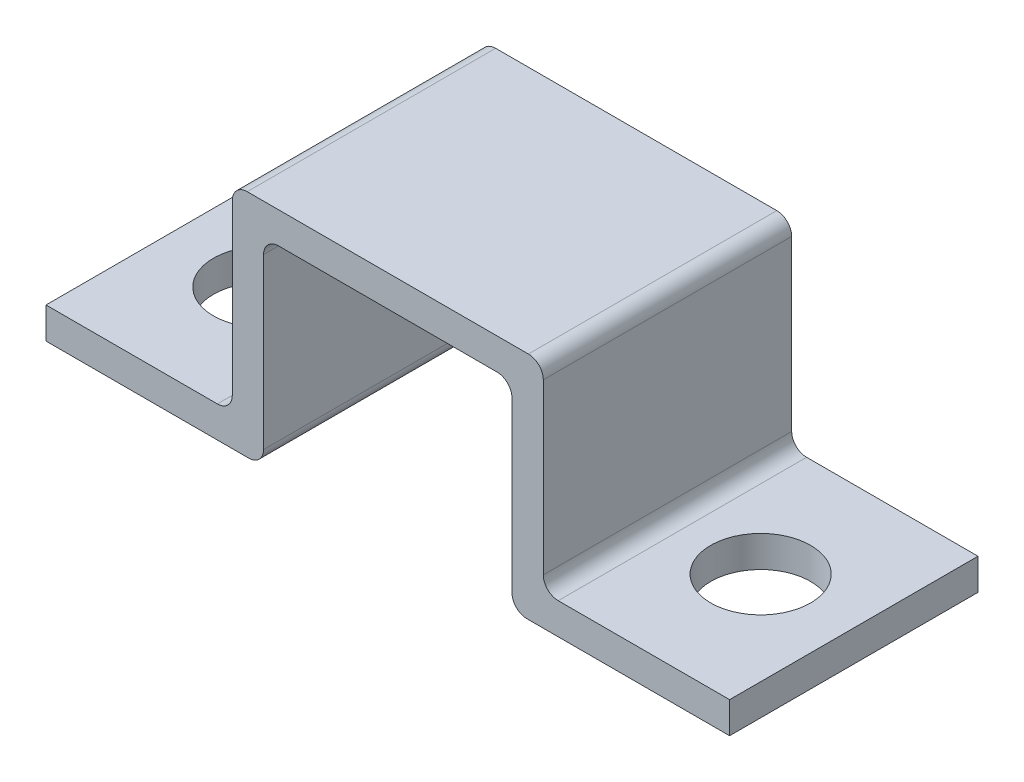
ISO-10303-21;
HEADER;
FILE_DESCRIPTION(('STEP AP214'),'2;1');
FILE_NAME('part.step','',(''),(''),'','','');
FILE_SCHEMA(('AUTOMOTIVE_DESIGN { 1 0 10303 214 1 1 1 1 }'));
ENDSEC;
DATA;
#1=APPLICATION_CONTEXT('core data for automotive mechanical design processes');
#2=APPLICATION_PROTOCOL_DEFINITION('international standard','automotive_design',2000,#1);
#3=PRODUCT_CONTEXT('',#1,'mechanical');
#4=PRODUCT('Part','Part','',(#3));
#5=PRODUCT_RELATED_PRODUCT_CATEGORY('part','',(#4));
#6=PRODUCT_DEFINITION_FORMATION('','',#4);
#7=PRODUCT_DEFINITION_CONTEXT('part definition',#1,'design');
#8=PRODUCT_DEFINITION('design','',#6,#7);
#9=PRODUCT_DEFINITION_SHAPE('','',#8);
#10=(LENGTH_UNIT() NAMED_UNIT(*) SI_UNIT(.MILLI.,.METRE.));
#11=(NAMED_UNIT(*) PLANE_ANGLE_UNIT() SI_UNIT($,.RADIAN.));
#12=(NAMED_UNIT(*) SI_UNIT($,.STERADIAN.) SOLID_ANGLE_UNIT());
#13=UNCERTAINTY_MEASURE_WITH_UNIT(LENGTH_MEASURE(1.E-05),#10,'distance_accuracy_value','');
#14=(GEOMETRIC_REPRESENTATION_CONTEXT(3) GLOBAL_UNCERTAINTY_ASSIGNED_CONTEXT((#13)) GLOBAL_UNIT_ASSIGNED_CONTEXT((#10,
#11,#12)) REPRESENTATION_CONTEXT('',''));
#15=CARTESIAN_POINT('',(0.,0.,0.));
#16=DIRECTION('',(0.,0.,1.));
#17=DIRECTION('',(1.,0.,0.));
#18=AXIS2_PLACEMENT_3D('',#15,#16,#17);
#19=CARTESIAN_POINT('',(-7.95019999999999,-10.16,6.35000000000001));
#20=DIRECTION('',(0.,-1.,0.));
#21=DIRECTION('',(0.,0.,-1.));
#22=AXIS2_PLACEMENT_3D('',#19,#20,#21);
#23=PLANE('',#22);
#24=DIRECTION('',(1.,0.,0.));
#25=VECTOR('',#24,1.);
#26=CARTESIAN_POINT('',(-7.95019999999999,-10.16,-6.35));
#27=LINE('',#26,#25);
#28=CARTESIAN_POINT('',(-17.4752,-10.16,-6.35));
#29=VERTEX_POINT('',#28);
#30=CARTESIAN_POINT('',(-7.11199999999999,-10.16,-6.35));
#31=VERTEX_POINT('',#30);
#32=EDGE_CURVE('E660',#29,#31,#27,.T.);
#33=ORIENTED_EDGE('',*,*,#32,.T.);
#34=DIRECTION('',(0.,0.,-1.));
#35=VECTOR('',#34,1.);
#36=CARTESIAN_POINT('',(-7.11199999999999,-10.16,6.35000000000001));
#37=LINE('',#36,#35);
#38=CARTESIAN_POINT('',(-7.11199999999999,-10.16,6.35000000000001));
#39=VERTEX_POINT('',#38);
#40=EDGE_CURVE('E390',#31,#39,#37,.F.);
#41=ORIENTED_EDGE('',*,*,#40,.T.);
#42=DIRECTION('',(1.,0.,0.));
#43=VECTOR('',#42,1.);
#44=CARTESIAN_POINT('',(-7.95019999999999,-10.16,6.35000000000001));
#45=LINE('',#44,#43);
#46=CARTESIAN_POINT('',(-17.4752,-10.16,6.35000000000001));
#47=VERTEX_POINT('',#46);
#48=EDGE_CURVE('E224',#47,#39,#45,.T.);
#49=ORIENTED_EDGE('',*,*,#48,.F.);
#50=DIRECTION('',(0.,0.,-1.));
#51=VECTOR('',#50,1.);
#52=CARTESIAN_POINT('',(-17.4752,-10.16,6.35000000000001));
#53=LINE('',#52,#51);
#54=EDGE_CURVE('E192',#47,#29,#53,.T.);
#55=ORIENTED_EDGE('',*,*,#54,.T.);
#56=EDGE_LOOP('',(#33,#41,#49,#55));
#57=FACE_BOUND('',#56,.T.);
#58=CARTESIAN_POINT('',(-12.7127,-10.16,0.));
#59=DIRECTION('',(0.,-1.,0.));
#60=DIRECTION('',(0.,0.,-1.));
#61=AXIS2_PLACEMENT_3D('',#58,#59,#60);
#62=CIRCLE('',#61,2.5527);
#63=CARTESIAN_POINT('',(-12.7127,-10.16,-2.5527));
#64=VERTEX_POINT('',#63);
#65=EDGE_CURVE('E193',#64,#64,#62,.F.);
#66=ORIENTED_EDGE('',*,*,#65,.T.);
#67=EDGE_LOOP('',(#66));
#68=FACE_BOUND('',#67,.T.);
#69=ADVANCED_FACE('F33',(#57,#68),#23,.T.);
#70=CARTESIAN_POINT('',(-17.4752,-8.5598,6.35000000000001));
#71=DIRECTION('',(0.,1.,0.));
#72=DIRECTION('',(0.,0.,1.));
#73=AXIS2_PLACEMENT_3D('',#70,#71,#72);
#74=PLANE('',#73);
#75=DIRECTION('',(1.,0.,0.));
#76=VECTOR('',#75,1.);
#77=CARTESIAN_POINT('',(-17.4752,-8.5598,6.35000000000001));
#78=LINE('',#77,#76);
#79=CARTESIAN_POINT('',(-17.4752,-8.5598,6.35000000000001));
#80=VERTEX_POINT('',#79);
#81=CARTESIAN_POINT('',(-8.7122,-8.5598,6.35000000000001));
#82=VERTEX_POINT('',#81);
#83=EDGE_CURVE('E171',#80,#82,#78,.T.);
#84=ORIENTED_EDGE('',*,*,#83,.T.);
#85=DIRECTION('',(0.,0.,1.));
#86=VECTOR('',#85,1.);
#87=CARTESIAN_POINT('',(-8.71219999999999,-8.5598,-6.35));
#88=LINE('',#87,#86);
#89=CARTESIAN_POINT('',(-8.7122,-8.5598,-6.35));
#90=VERTEX_POINT('',#89);
#91=EDGE_CURVE('E354',#82,#90,#88,.F.);
#92=ORIENTED_EDGE('',*,*,#91,.T.);
#93=DIRECTION('',(1.,0.,0.));
#94=VECTOR('',#93,1.);
#95=CARTESIAN_POINT('',(-17.4752,-8.5598,-6.35));
#96=LINE('',#95,#94);
#97=CARTESIAN_POINT('',(-17.4752,-8.5598,-6.35));
#98=VERTEX_POINT('',#97);
#99=EDGE_CURVE('E183',#98,#90,#96,.T.);
#100=ORIENTED_EDGE('',*,*,#99,.F.);
#101=DIRECTION('',(0.,0.,1.));
#102=VECTOR('',#101,1.);
#103=CARTESIAN_POINT('',(-17.4752,-8.5598,6.35000000000001));
#104=LINE('',#103,#102);
#105=EDGE_CURVE('E189',#98,#80,#104,.T.);
#106=ORIENTED_EDGE('',*,*,#105,.T.);
#107=EDGE_LOOP('',(#84,#92,#100,#106));
#108=FACE_BOUND('',#107,.T.);
#109=CARTESIAN_POINT('',(-12.7127,-8.5598,0.));
#110=DIRECTION('',(0.,-1.,0.));
#111=DIRECTION('',(0.,0.,1.));
#112=AXIS2_PLACEMENT_3D('',#109,#110,#111);
#113=CIRCLE('',#112,2.5527);
#114=CARTESIAN_POINT('',(-12.7127,-8.5598,2.5527));
#115=VERTEX_POINT('',#114);
#116=EDGE_CURVE('E656',#115,#115,#113,.T.);
#117=ORIENTED_EDGE('',*,*,#116,.T.);
#118=EDGE_LOOP('',(#117));
#119=FACE_BOUND('',#118,.T.);
#120=ADVANCED_FACE('F195',(#108,#119),#74,.T.);
#121=CARTESIAN_POINT('',(-7.95019999999999,0.,0.));
#122=DIRECTION('',(-1.,0.,0.));
#123=DIRECTION('',(0.,0.,-1.));
#124=AXIS2_PLACEMENT_3D('',#121,#122,#123);
#125=PLANE('',#124);
#126=DIRECTION('',(0.,1.,0.));
#127=VECTOR('',#126,1.);
#128=CARTESIAN_POINT('',(-7.95019999999999,1.6002,-6.34999999999999));
#129=LINE('',#128,#127);
#130=CARTESIAN_POINT('',(-7.95019999999999,-7.7978,-6.35));
#131=VERTEX_POINT('',#130);
#132=CARTESIAN_POINT('',(-7.95019999999999,0.8382,-6.34999999999999));
#133=VERTEX_POINT('',#132);
#134=EDGE_CURVE('E212',#131,#133,#129,.T.);
#135=ORIENTED_EDGE('',*,*,#134,.F.);
#136=DIRECTION('',(0.,0.,1.));
#137=VECTOR('',#136,1.);
#138=CARTESIAN_POINT('',(-7.95019999999999,-7.7978,6.35000000000001));
#139=LINE('',#138,#137);
#140=CARTESIAN_POINT('',(-7.95019999999999,-7.7978,6.35000000000001));
#141=VERTEX_POINT('',#140);
#142=EDGE_CURVE('E398',#131,#141,#139,.T.);
#143=ORIENTED_EDGE('',*,*,#142,.T.);
#144=DIRECTION('',(0.,-1.,0.));
#145=VECTOR('',#144,1.);
#146=CARTESIAN_POINT('',(-7.95019999999999,1.6002,6.35000000000001));
#147=LINE('',#146,#145);
#148=CARTESIAN_POINT('',(-7.95019999999999,0.8382,6.35000000000001));
#149=VERTEX_POINT('',#148);
#150=EDGE_CURVE('E209',#149,#141,#147,.T.);
#151=ORIENTED_EDGE('',*,*,#150,.F.);
#152=DIRECTION('',(0.,0.,1.));
#153=VECTOR('',#152,1.);
#154=CARTESIAN_POINT('',(-7.95019999999999,0.8382,-6.34999999999999));
#155=LINE('',#154,#153);
#156=EDGE_CURVE('E396',#149,#133,#155,.F.);
#157=ORIENTED_EDGE('',*,*,#156,.T.);
#158=EDGE_LOOP('',(#135,#143,#151,#157));
#159=FACE_BOUND('',#158,.T.);
#160=ADVANCED_FACE('F405',(#159),#125,.T.);
#161=CARTESIAN_POINT('',(-6.35000000000001,1.6002,-6.34999999999999));
#162=DIRECTION('',(0.,0.,1.));
#163=DIRECTION('',(1.,0.,0.));
#164=AXIS2_PLACEMENT_3D('',#161,#162,#163);
#165=PLANE('',#164);
#166=DIRECTION('',(-1.,0.,0.));
#167=VECTOR('',#166,1.);
#168=CARTESIAN_POINT('',(7.95019999999999,-10.16,-6.35));
#169=LINE('',#168,#167);
#170=CARTESIAN_POINT('',(17.4752,-10.16,-6.35));
#171=VERTEX_POINT('',#170);
#172=CARTESIAN_POINT('',(7.11199999999999,-10.16,-6.35));
#173=VERTEX_POINT('',#172);
#174=EDGE_CURVE('E239',#171,#173,#169,.T.);
#175=ORIENTED_EDGE('',*,*,#174,.T.);
#176=CARTESIAN_POINT('',(7.11199999999999,-9.398,-6.34999999999999));
#177=DIRECTION('',(0.,0.,1.));
#178=DIRECTION('',(1.,0.,0.));
#179=AXIS2_PLACEMENT_3D('',#176,#177,#178);
#180=CIRCLE('',#179,0.762);
#181=CARTESIAN_POINT('',(6.34999999999999,-9.398,-6.35));
#182=VERTEX_POINT('',#181);
#183=EDGE_CURVE('E255',#173,#182,#180,.F.);
#184=ORIENTED_EDGE('',*,*,#183,.T.);
#185=DIRECTION('',(0.,1.,0.));
#186=VECTOR('',#185,1.);
#187=CARTESIAN_POINT('',(6.34999999999999,1.6002,-6.34999999999999));
#188=LINE('',#187,#186);
#189=CARTESIAN_POINT('',(6.34999999999999,-0.761999999999999,-6.34999999999999));
#190=VERTEX_POINT('',#189);
#191=EDGE_CURVE('E240',#182,#190,#188,.T.);
#192=ORIENTED_EDGE('',*,*,#191,.T.);
#193=CARTESIAN_POINT('',(5.58799999999999,-0.762,-6.34999999999999));
#194=DIRECTION('',(0.,0.,1.));
#195=DIRECTION('',(1.,0.,0.));
#196=AXIS2_PLACEMENT_3D('',#193,#194,#195);
#197=CIRCLE('',#196,0.762);
#198=CARTESIAN_POINT('',(5.58799999999999,0.,-6.34999999999999));
#199=VERTEX_POINT('',#198);
#200=EDGE_CURVE('E361',#190,#199,#197,.T.);
#201=ORIENTED_EDGE('',*,*,#200,.T.);
#202=DIRECTION('',(-1.,0.,0.));
#203=VECTOR('',#202,1.);
#204=CARTESIAN_POINT('',(-6.35000000000001,0.,-6.34999999999999));
#205=LINE('',#204,#203);
#206=CARTESIAN_POINT('',(-5.58799999999999,0.,-6.34999999999999));
#207=VERTEX_POINT('',#206);
#208=EDGE_CURVE('E230',#199,#207,#205,.T.);
#209=ORIENTED_EDGE('',*,*,#208,.T.);
#210=CARTESIAN_POINT('',(-5.58799999999999,-0.762,-6.34999999999999));
#211=DIRECTION('',(0.,0.,1.));
#212=DIRECTION('',(1.,0.,0.));
#213=AXIS2_PLACEMENT_3D('',#210,#211,#212);
#214=CIRCLE('',#213,0.762);
#215=CARTESIAN_POINT('',(-6.34999999999999,-0.761999999999999,-6.34999999999999));
#216=VERTEX_POINT('',#215);
#217=EDGE_CURVE('E366',#207,#216,#214,.T.);
#218=ORIENTED_EDGE('',*,*,#217,.T.);
#219=DIRECTION('',(0.,1.,0.));
#220=VECTOR('',#219,1.);
#221=CARTESIAN_POINT('',(-6.34999999999999,1.6002,-6.34999999999999));
#222=LINE('',#221,#220);
#223=CARTESIAN_POINT('',(-6.34999999999999,-9.398,-6.35));
#224=VERTEX_POINT('',#223);
#225=EDGE_CURVE('E213',#224,#216,#222,.T.);
#226=ORIENTED_EDGE('',*,*,#225,.F.);
#227=CARTESIAN_POINT('',(-7.11199999999999,-9.398,-6.34999999999999));
#228=DIRECTION('',(0.,0.,1.));
#229=DIRECTION('',(1.,0.,0.));
#230=AXIS2_PLACEMENT_3D('',#227,#228,#229);
#231=CIRCLE('',#230,0.762);
#232=EDGE_CURVE('E334',#224,#31,#231,.F.);
#233=ORIENTED_EDGE('',*,*,#232,.T.);
#234=ORIENTED_EDGE('',*,*,#32,.F.);
#235=DIRECTION('',(0.,1.,0.));
#236=VECTOR('',#235,1.);
#237=CARTESIAN_POINT('',(-17.4752,-10.16,-6.35));
#238=LINE('',#237,#236);
#239=EDGE_CURVE('E198',#29,#98,#238,.T.);
#240=ORIENTED_EDGE('',*,*,#239,.T.);
#241=ORIENTED_EDGE('',*,*,#99,.T.);
#242=CARTESIAN_POINT('',(-8.71219999999999,-7.7978,-6.34999999999999));
#243=DIRECTION('',(0.,0.,1.));
#244=DIRECTION('',(1.,0.,0.));
#245=AXIS2_PLACEMENT_3D('',#242,#243,#244);
#246=CIRCLE('',#245,0.762);
#247=EDGE_CURVE('E369',#90,#131,#246,.T.);
#248=ORIENTED_EDGE('',*,*,#247,.T.);
#249=ORIENTED_EDGE('',*,*,#134,.T.);
#250=CARTESIAN_POINT('',(-7.18819999999999,0.8382,-6.34999999999999));
#251=DIRECTION('',(0.,0.,1.));
#252=DIRECTION('',(1.,0.,0.));
#253=AXIS2_PLACEMENT_3D('',#250,#251,#252);
#254=CIRCLE('',#253,0.762);
#255=CARTESIAN_POINT('',(-7.18819999999999,1.6002,-6.34999999999999));
#256=VERTEX_POINT('',#255);
#257=EDGE_CURVE('E291',#133,#256,#254,.F.);
#258=ORIENTED_EDGE('',*,*,#257,.T.);
#259=DIRECTION('',(-1.,0.,0.));
#260=VECTOR('',#259,1.);
#261=CARTESIAN_POINT('',(-6.35000000000001,1.6002,-6.34999999999999));
#262=LINE('',#261,#260);
#263=CARTESIAN_POINT('',(7.18819999999999,1.6002,-6.34999999999999));
#264=VERTEX_POINT('',#263);
#265=EDGE_CURVE('E264',#264,#256,#262,.T.);
#266=ORIENTED_EDGE('',*,*,#265,.F.);
#267=CARTESIAN_POINT('',(7.18819999999999,0.8382,-6.34999999999999));
#268=DIRECTION('',(0.,0.,1.));
#269=DIRECTION('',(1.,0.,0.));
#270=AXIS2_PLACEMENT_3D('',#267,#268,#269);
#271=CIRCLE('',#270,0.762);
#272=CARTESIAN_POINT('',(7.95019999999999,0.8382,-6.34999999999999));
#273=VERTEX_POINT('',#272);
#274=EDGE_CURVE('E285',#264,#273,#271,.F.);
#275=ORIENTED_EDGE('',*,*,#274,.T.);
#276=DIRECTION('',(0.,1.,0.));
#277=VECTOR('',#276,1.);
#278=CARTESIAN_POINT('',(7.95019999999999,1.6002,-6.34999999999999));
#279=LINE('',#278,#277);
#280=CARTESIAN_POINT('',(7.95019999999999,-7.7978,-6.35));
#281=VERTEX_POINT('',#280);
#282=EDGE_CURVE('E235',#281,#273,#279,.T.);
#283=ORIENTED_EDGE('',*,*,#282,.F.);
#284=CARTESIAN_POINT('',(8.71219999999999,-7.7978,-6.34999999999999));
#285=DIRECTION('',(0.,0.,1.));
#286=DIRECTION('',(1.,0.,0.));
#287=AXIS2_PLACEMENT_3D('',#284,#285,#286);
#288=CIRCLE('',#287,0.762);
#289=CARTESIAN_POINT('',(8.7122,-8.5598,-6.35));
#290=VERTEX_POINT('',#289);
#291=EDGE_CURVE('E11',#281,#290,#288,.T.);
#292=ORIENTED_EDGE('',*,*,#291,.T.);
#293=DIRECTION('',(-1.,0.,0.));
#294=VECTOR('',#293,1.);
#295=CARTESIAN_POINT('',(17.4752,-8.5598,-6.35));
#296=LINE('',#295,#294);
#297=CARTESIAN_POINT('',(17.4752,-8.5598,-6.35));
#298=VERTEX_POINT('',#297);
#299=EDGE_CURVE('E254',#298,#290,#296,.T.);
#300=ORIENTED_EDGE('',*,*,#299,.F.);
#301=DIRECTION('',(0.,1.,0.));
#302=VECTOR('',#301,1.);
#303=CARTESIAN_POINT('',(17.4752,-10.16,-6.35));
#304=LINE('',#303,#302);
#305=EDGE_CURVE('E307',#171,#298,#304,.T.);
#306=ORIENTED_EDGE('',*,*,#305,.F.);
#307=EDGE_LOOP('',(#175,#184,#192,#201,#209,#218,#226,#233,#234,#240,#241,#248,#249,#258,#266,
#275,#283,#292,#300,#306));
#308=FACE_BOUND('',#307,.T.);
#309=ADVANCED_FACE('F303',(#308),#165,.F.);
#310=CARTESIAN_POINT('',(-6.35000000000001,1.6002,6.35000000000001));
#311=DIRECTION('',(0.,0.,-1.));
#312=DIRECTION('',(-1.,0.,0.));
#313=AXIS2_PLACEMENT_3D('',#310,#311,#312);
#314=PLANE('',#313);
#315=DIRECTION('',(0.,-1.,0.));
#316=VECTOR('',#315,1.);
#317=CARTESIAN_POINT('',(6.34999999999999,1.6002,6.35000000000001));
#318=LINE('',#317,#316);
#319=CARTESIAN_POINT('',(6.34999999999999,-0.761999999999999,6.35000000000001));
#320=VERTEX_POINT('',#319);
#321=CARTESIAN_POINT('',(6.34999999999999,-9.398,6.35000000000001));
#322=VERTEX_POINT('',#321);
#323=EDGE_CURVE('E251',#320,#322,#318,.T.);
#324=ORIENTED_EDGE('',*,*,#323,.T.);
#325=CARTESIAN_POINT('',(7.11199999999999,-9.398,6.35000000000001));
#326=DIRECTION('',(0.,0.,-1.));
#327=DIRECTION('',(-1.,0.,0.));
#328=AXIS2_PLACEMENT_3D('',#325,#326,#327);
#329=CIRCLE('',#328,0.762);
#330=CARTESIAN_POINT('',(7.11199999999999,-10.16,6.35000000000001));
#331=VERTEX_POINT('',#330);
#332=EDGE_CURVE('E330',#322,#331,#329,.F.);
#333=ORIENTED_EDGE('',*,*,#332,.T.);
#334=DIRECTION('',(-1.,0.,0.));
#335=VECTOR('',#334,1.);
#336=CARTESIAN_POINT('',(7.95019999999999,-10.16,6.35000000000001));
#337=LINE('',#336,#335);
#338=CARTESIAN_POINT('',(17.4752,-10.16,6.35000000000001));
#339=VERTEX_POINT('',#338);
#340=EDGE_CURVE('E300',#339,#331,#337,.T.);
#341=ORIENTED_EDGE('',*,*,#340,.F.);
#342=DIRECTION('',(0.,-1.,0.));
#343=VECTOR('',#342,1.);
#344=CARTESIAN_POINT('',(17.4752,-10.16,6.35000000000001));
#345=LINE('',#344,#343);
#346=CARTESIAN_POINT('',(17.4752,-8.5598,6.35000000000001));
#347=VERTEX_POINT('',#346);
#348=EDGE_CURVE('E316',#347,#339,#345,.T.);
#349=ORIENTED_EDGE('',*,*,#348,.F.);
#350=DIRECTION('',(-1.,0.,0.));
#351=VECTOR('',#350,1.);
#352=CARTESIAN_POINT('',(17.4752,-8.5598,6.35000000000001));
#353=LINE('',#352,#351);
#354=CARTESIAN_POINT('',(8.7122,-8.5598,6.35000000000001));
#355=VERTEX_POINT('',#354);
#356=EDGE_CURVE('E269',#347,#355,#353,.T.);
#357=ORIENTED_EDGE('',*,*,#356,.T.);
#358=CARTESIAN_POINT('',(8.71219999999999,-7.7978,6.35000000000001));
#359=DIRECTION('',(0.,0.,-1.));
#360=DIRECTION('',(-1.,0.,0.));
#361=AXIS2_PLACEMENT_3D('',#358,#359,#360);
#362=CIRCLE('',#361,0.762);
#363=CARTESIAN_POINT('',(7.95019999999999,-7.7978,6.35000000000001));
#364=VERTEX_POINT('',#363);
#365=EDGE_CURVE('E41',#355,#364,#362,.T.);
#366=ORIENTED_EDGE('',*,*,#365,.T.);
#367=DIRECTION('',(0.,-1.,0.));
#368=VECTOR('',#367,1.);
#369=CARTESIAN_POINT('',(7.95019999999999,1.6002,6.35000000000001));
#370=LINE('',#369,#368);
#371=CARTESIAN_POINT('',(7.95019999999999,0.8382,6.35000000000001));
#372=VERTEX_POINT('',#371);
#373=EDGE_CURVE('E214',#372,#364,#370,.T.);
#374=ORIENTED_EDGE('',*,*,#373,.F.);
#375=CARTESIAN_POINT('',(7.18819999999999,0.8382,6.35000000000001));
#376=DIRECTION('',(0.,0.,-1.));
#377=DIRECTION('',(-1.,0.,0.));
#378=AXIS2_PLACEMENT_3D('',#375,#376,#377);
#379=CIRCLE('',#378,0.762);
#380=CARTESIAN_POINT('',(7.18819999999999,1.6002,6.35000000000001));
#381=VERTEX_POINT('',#380);
#382=EDGE_CURVE('E218',#372,#381,#379,.F.);
#383=ORIENTED_EDGE('',*,*,#382,.T.);
#384=DIRECTION('',(1.,0.,0.));
#385=VECTOR('',#384,1.);
#386=CARTESIAN_POINT('',(-6.35000000000001,1.6002,6.35000000000001));
#387=LINE('',#386,#385);
#388=CARTESIAN_POINT('',(-7.18819999999999,1.6002,6.35000000000001));
#389=VERTEX_POINT('',#388);
#390=EDGE_CURVE('E286',#389,#381,#387,.T.);
#391=ORIENTED_EDGE('',*,*,#390,.F.);
#392=CARTESIAN_POINT('',(-7.18819999999999,0.8382,6.35000000000001));
#393=DIRECTION('',(0.,0.,-1.));
#394=DIRECTION('',(-1.,0.,0.));
#395=AXIS2_PLACEMENT_3D('',#392,#393,#394);
#396=CIRCLE('',#395,0.762);
#397=EDGE_CURVE('E349',#389,#149,#396,.F.);
#398=ORIENTED_EDGE('',*,*,#397,.T.);
#399=ORIENTED_EDGE('',*,*,#150,.T.);
#400=CARTESIAN_POINT('',(-8.71219999999999,-7.7978,6.35000000000001));
#401=DIRECTION('',(0.,0.,-1.));
#402=DIRECTION('',(-1.,0.,0.));
#403=AXIS2_PLACEMENT_3D('',#400,#401,#402);
#404=CIRCLE('',#403,0.762);
#405=EDGE_CURVE('E178',#141,#82,#404,.T.);
#406=ORIENTED_EDGE('',*,*,#405,.T.);
#407=ORIENTED_EDGE('',*,*,#83,.F.);
#408=DIRECTION('',(0.,-1.,0.));
#409=VECTOR('',#408,1.);
#410=CARTESIAN_POINT('',(-17.4752,-10.16,6.35000000000001));
#411=LINE('',#410,#409);
#412=EDGE_CURVE('E175',#80,#47,#411,.T.);
#413=ORIENTED_EDGE('',*,*,#412,.T.);
#414=ORIENTED_EDGE('',*,*,#48,.T.);
#415=CARTESIAN_POINT('',(-7.11199999999999,-9.398,6.35000000000001));
#416=DIRECTION('',(0.,0.,-1.));
#417=DIRECTION('',(-1.,0.,0.));
#418=AXIS2_PLACEMENT_3D('',#415,#416,#417);
#419=CIRCLE('',#418,0.762);
#420=CARTESIAN_POINT('',(-6.34999999999999,-9.398,6.35000000000001));
#421=VERTEX_POINT('',#420);
#422=EDGE_CURVE('E48',#39,#421,#419,.F.);
#423=ORIENTED_EDGE('',*,*,#422,.T.);
#424=DIRECTION('',(0.,-1.,0.));
#425=VECTOR('',#424,1.);
#426=CARTESIAN_POINT('',(-6.34999999999999,1.6002,6.35000000000001));
#427=LINE('',#426,#425);
#428=CARTESIAN_POINT('',(-6.34999999999999,-0.761999999999999,6.35000000000001));
#429=VERTEX_POINT('',#428);
#430=EDGE_CURVE('E182',#429,#421,#427,.T.);
#431=ORIENTED_EDGE('',*,*,#430,.F.);
#432=CARTESIAN_POINT('',(-5.58799999999999,-0.762,6.35000000000001));
#433=DIRECTION('',(0.,0.,-1.));
#434=DIRECTION('',(-1.,0.,0.));
#435=AXIS2_PLACEMENT_3D('',#432,#433,#434);
#436=CIRCLE('',#435,0.762);
#437=CARTESIAN_POINT('',(-5.58799999999999,0.,6.35000000000001));
#438=VERTEX_POINT('',#437);
#439=EDGE_CURVE('E56',#429,#438,#436,.T.);
#440=ORIENTED_EDGE('',*,*,#439,.T.);
#441=DIRECTION('',(1.,0.,0.));
#442=VECTOR('',#441,1.);
#443=CARTESIAN_POINT('',(-6.35000000000001,0.,6.35000000000001));
#444=LINE('',#443,#442);
#445=CARTESIAN_POINT('',(5.58799999999999,0.,6.35000000000001));
#446=VERTEX_POINT('',#445);
#447=EDGE_CURVE('E261',#438,#446,#444,.T.);
#448=ORIENTED_EDGE('',*,*,#447,.T.);
#449=CARTESIAN_POINT('',(5.58799999999999,-0.762,6.35000000000001));
#450=DIRECTION('',(0.,0.,-1.));
#451=DIRECTION('',(-1.,0.,0.));
#452=AXIS2_PLACEMENT_3D('',#449,#450,#451);
#453=CIRCLE('',#452,0.762);
#454=EDGE_CURVE('E363',#446,#320,#453,.T.);
#455=ORIENTED_EDGE('',*,*,#454,.T.);
#456=EDGE_LOOP('',(#324,#333,#341,#349,#357,#366,#374,#383,#391,#398,#399,#406,#407,#413,#414,
#423,#431,#440,#448,#455));
#457=FACE_BOUND('',#456,.T.);
#458=ADVANCED_FACE('F174',(#457),#314,.F.);
#459=CARTESIAN_POINT('',(0.,1.6002,0.));
#460=DIRECTION('',(0.,-1.,0.));
#461=DIRECTION('',(0.,0.,-1.));
#462=AXIS2_PLACEMENT_3D('',#459,#460,#461);
#463=PLANE('',#462);
#464=ORIENTED_EDGE('',*,*,#265,.T.);
#465=DIRECTION('',(0.,0.,1.));
#466=VECTOR('',#465,1.);
#467=CARTESIAN_POINT('',(-7.18819999999999,1.6002,6.35000000000001));
#468=LINE('',#467,#466);
#469=EDGE_CURVE('E346',#256,#389,#468,.T.);
#470=ORIENTED_EDGE('',*,*,#469,.T.);
#471=ORIENTED_EDGE('',*,*,#390,.T.);
#472=DIRECTION('',(0.,0.,1.));
#473=VECTOR('',#472,1.);
#474=CARTESIAN_POINT('',(7.18819999999999,1.6002,-6.34999999999999));
#475=LINE('',#474,#473);
#476=EDGE_CURVE('E347',#381,#264,#475,.F.);
#477=ORIENTED_EDGE('',*,*,#476,.T.);
#478=EDGE_LOOP('',(#464,#470,#471,#477));
#479=FACE_BOUND('',#478,.T.);
#480=ADVANCED_FACE('F345',(#479),#463,.F.);
#481=CARTESIAN_POINT('',(0.,0.,0.));
#482=DIRECTION('',(0.,-1.,0.));
#483=DIRECTION('',(0.,0.,-1.));
#484=AXIS2_PLACEMENT_3D('',#481,#482,#483);
#485=PLANE('',#484);
#486=ORIENTED_EDGE('',*,*,#208,.F.);
#487=DIRECTION('',(0.,0.,-1.));
#488=VECTOR('',#487,1.);
#489=CARTESIAN_POINT('',(5.58799999999999,0.,0.));
#490=LINE('',#489,#488);
#491=EDGE_CURVE('E394',#199,#446,#490,.F.);
#492=ORIENTED_EDGE('',*,*,#491,.T.);
#493=ORIENTED_EDGE('',*,*,#447,.F.);
#494=DIRECTION('',(0.,0.,1.));
#495=VECTOR('',#494,1.);
#496=CARTESIAN_POINT('',(-5.58799999999999,0.,0.));
#497=LINE('',#496,#495);
#498=EDGE_CURVE('E392',#438,#207,#497,.F.);
#499=ORIENTED_EDGE('',*,*,#498,.T.);
#500=EDGE_LOOP('',(#486,#492,#493,#499));
#501=FACE_BOUND('',#500,.T.);
#502=ADVANCED_FACE('F438',(#501),#485,.T.);
#503=CARTESIAN_POINT('',(6.34999999999999,0.,0.));
#504=DIRECTION('',(1.,0.,0.));
#505=DIRECTION('',(0.,0.,-1.));
#506=AXIS2_PLACEMENT_3D('',#503,#504,#505);
#507=PLANE('',#506);
#508=ORIENTED_EDGE('',*,*,#191,.F.);
#509=DIRECTION('',(0.,0.,-1.));
#510=VECTOR('',#509,1.);
#511=CARTESIAN_POINT('',(6.34999999999999,-9.398,0.));
#512=LINE('',#511,#510);
#513=EDGE_CURVE('E260',#182,#322,#512,.F.);
#514=ORIENTED_EDGE('',*,*,#513,.T.);
#515=ORIENTED_EDGE('',*,*,#323,.F.);
#516=DIRECTION('',(0.,0.,-1.));
#517=VECTOR('',#516,1.);
#518=CARTESIAN_POINT('',(6.34999999999999,-0.762,0.));
#519=LINE('',#518,#517);
#520=EDGE_CURVE('E257',#320,#190,#519,.T.);
#521=ORIENTED_EDGE('',*,*,#520,.T.);
#522=EDGE_LOOP('',(#508,#514,#515,#521));
#523=FACE_BOUND('',#522,.T.);
#524=ADVANCED_FACE('F435',(#523),#507,.F.);
#525=CARTESIAN_POINT('',(7.95019999999999,-10.16,6.35000000000001));
#526=DIRECTION('',(0.,1.,0.));
#527=DIRECTION('',(0.,0.,1.));
#528=AXIS2_PLACEMENT_3D('',#525,#526,#527);
#529=PLANE('',#528);
#530=CARTESIAN_POINT('',(12.7127,-10.16,0.));
#531=DIRECTION('',(0.,1.,0.));
#532=DIRECTION('',(0.,0.,1.));
#533=AXIS2_PLACEMENT_3D('',#530,#531,#532);
#534=CIRCLE('',#533,2.5527);
#535=CARTESIAN_POINT('',(12.7127,-10.16,2.5527));
#536=VERTEX_POINT('',#535);
#537=EDGE_CURVE('E319',#536,#536,#534,.T.);
#538=ORIENTED_EDGE('',*,*,#537,.T.);
#539=EDGE_LOOP('',(#538));
#540=FACE_BOUND('',#539,.T.);
#541=ORIENTED_EDGE('',*,*,#340,.T.);
#542=DIRECTION('',(0.,0.,-1.));
#543=VECTOR('',#542,1.);
#544=CARTESIAN_POINT('',(7.11199999999999,-10.16,6.35000000000001));
#545=LINE('',#544,#543);
#546=EDGE_CURVE('E283',#331,#173,#545,.T.);
#547=ORIENTED_EDGE('',*,*,#546,.T.);
#548=ORIENTED_EDGE('',*,*,#174,.F.);
#549=DIRECTION('',(0.,0.,-1.));
#550=VECTOR('',#549,1.);
#551=CARTESIAN_POINT('',(17.4752,-10.16,6.35000000000001));
#552=LINE('',#551,#550);
#553=EDGE_CURVE('E311',#339,#171,#552,.T.);
#554=ORIENTED_EDGE('',*,*,#553,.F.);
#555=EDGE_LOOP('',(#541,#547,#548,#554));
#556=FACE_BOUND('',#555,.T.);
#557=ADVANCED_FACE('F310',(#540,#556),#529,.F.);
#558=CARTESIAN_POINT('',(7.95019999999999,0.,0.));
#559=DIRECTION('',(1.,0.,0.));
#560=DIRECTION('',(0.,0.,-1.));
#561=AXIS2_PLACEMENT_3D('',#558,#559,#560);
#562=PLANE('',#561);
#563=ORIENTED_EDGE('',*,*,#282,.T.);
#564=DIRECTION('',(0.,0.,1.));
#565=VECTOR('',#564,1.);
#566=CARTESIAN_POINT('',(7.95019999999999,0.8382,6.35000000000001));
#567=LINE('',#566,#565);
#568=EDGE_CURVE('E352',#273,#372,#567,.T.);
#569=ORIENTED_EDGE('',*,*,#568,.T.);
#570=ORIENTED_EDGE('',*,*,#373,.T.);
#571=DIRECTION('',(0.,0.,1.));
#572=VECTOR('',#571,1.);
#573=CARTESIAN_POINT('',(7.95019999999999,-7.7978,0.));
#574=LINE('',#573,#572);
#575=EDGE_CURVE('E350',#364,#281,#574,.F.);
#576=ORIENTED_EDGE('',*,*,#575,.T.);
#577=EDGE_LOOP('',(#563,#569,#570,#576));
#578=FACE_BOUND('',#577,.T.);
#579=ADVANCED_FACE('F375',(#578),#562,.T.);
#580=CARTESIAN_POINT('',(17.4752,-8.5598,6.35000000000001));
#581=DIRECTION('',(0.,-1.,0.));
#582=DIRECTION('',(0.,0.,-1.));
#583=AXIS2_PLACEMENT_3D('',#580,#581,#582);
#584=PLANE('',#583);
#585=CARTESIAN_POINT('',(12.7127,-8.5598,0.));
#586=DIRECTION('',(0.,1.,0.));
#587=DIRECTION('',(0.,0.,1.));
#588=AXIS2_PLACEMENT_3D('',#585,#586,#587);
#589=CIRCLE('',#588,2.5527);
#590=CARTESIAN_POINT('',(12.7127,-8.5598,2.5527));
#591=VERTEX_POINT('',#590);
#592=EDGE_CURVE('E661',#591,#591,#589,.T.);
#593=ORIENTED_EDGE('',*,*,#592,.F.);
#594=EDGE_LOOP('',(#593));
#595=FACE_BOUND('',#594,.T.);
#596=ORIENTED_EDGE('',*,*,#299,.T.);
#597=DIRECTION('',(0.,0.,1.));
#598=VECTOR('',#597,1.);
#599=CARTESIAN_POINT('',(8.71219999999999,-8.5598,6.35000000000001));
#600=LINE('',#599,#598);
#601=EDGE_CURVE('E328',#290,#355,#600,.T.);
#602=ORIENTED_EDGE('',*,*,#601,.T.);
#603=ORIENTED_EDGE('',*,*,#356,.F.);
#604=DIRECTION('',(0.,0.,1.));
#605=VECTOR('',#604,1.);
#606=CARTESIAN_POINT('',(17.4752,-8.5598,6.35000000000001));
#607=LINE('',#606,#605);
#608=EDGE_CURVE('E272',#298,#347,#607,.T.);
#609=ORIENTED_EDGE('',*,*,#608,.F.);
#610=EDGE_LOOP('',(#596,#602,#603,#609));
#611=FACE_BOUND('',#610,.T.);
#612=ADVANCED_FACE('F326',(#595,#611),#584,.F.);
#613=CARTESIAN_POINT('',(17.4752,0.,0.));
#614=DIRECTION('',(-1.,0.,0.));
#615=DIRECTION('',(0.,0.,1.));
#616=AXIS2_PLACEMENT_3D('',#613,#614,#615);
#617=PLANE('',#616);
#618=ORIENTED_EDGE('',*,*,#348,.T.);
#619=ORIENTED_EDGE('',*,*,#553,.T.);
#620=ORIENTED_EDGE('',*,*,#305,.T.);
#621=ORIENTED_EDGE('',*,*,#608,.T.);
#622=EDGE_LOOP('',(#618,#619,#620,#621));
#623=FACE_BOUND('',#622,.T.);
#624=ADVANCED_FACE('F314',(#623),#617,.F.);
#625=CARTESIAN_POINT('',(12.7127,-10.160025,0.));
#626=DIRECTION('',(0.,1.,0.));
#627=DIRECTION('',(0.,0.,1.));
#628=AXIS2_PLACEMENT_3D('',#625,#626,#627);
#629=CYLINDRICAL_SURFACE('',#628,2.5527);
#630=ORIENTED_EDGE('',*,*,#592,.T.);
#631=EDGE_LOOP('',(#630));
#632=FACE_BOUND('',#631,.T.);
#633=ORIENTED_EDGE('',*,*,#537,.F.);
#634=EDGE_LOOP('',(#633));
#635=FACE_BOUND('',#634,.T.);
#636=ADVANCED_FACE('F424',(#632,#635),#629,.F.);
#637=CARTESIAN_POINT('',(-6.34999999999999,0.,0.));
#638=DIRECTION('',(-1.,0.,0.));
#639=DIRECTION('',(0.,0.,-1.));
#640=AXIS2_PLACEMENT_3D('',#637,#638,#639);
#641=PLANE('',#640);
#642=ORIENTED_EDGE('',*,*,#430,.T.);
#643=DIRECTION('',(0.,0.,-1.));
#644=VECTOR('',#643,1.);
#645=CARTESIAN_POINT('',(-6.34999999999999,-9.398,-6.35));
#646=LINE('',#645,#644);
#647=EDGE_CURVE('E387',#421,#224,#646,.T.);
#648=ORIENTED_EDGE('',*,*,#647,.T.);
#649=ORIENTED_EDGE('',*,*,#225,.T.);
#650=DIRECTION('',(0.,0.,1.));
#651=VECTOR('',#650,1.);
#652=CARTESIAN_POINT('',(-6.34999999999999,-0.762,0.));
#653=LINE('',#652,#651);
#654=EDGE_CURVE('E385',#216,#429,#653,.T.);
#655=ORIENTED_EDGE('',*,*,#654,.T.);
#656=EDGE_LOOP('',(#642,#648,#649,#655));
#657=FACE_BOUND('',#656,.T.);
#658=ADVANCED_FACE('F423',(#657),#641,.F.);
#659=CARTESIAN_POINT('',(-17.4752,0.,0.));
#660=DIRECTION('',(1.,0.,0.));
#661=DIRECTION('',(0.,0.,1.));
#662=AXIS2_PLACEMENT_3D('',#659,#660,#661);
#663=PLANE('',#662);
#664=ORIENTED_EDGE('',*,*,#412,.F.);
#665=ORIENTED_EDGE('',*,*,#105,.F.);
#666=ORIENTED_EDGE('',*,*,#239,.F.);
#667=ORIENTED_EDGE('',*,*,#54,.F.);
#668=EDGE_LOOP('',(#664,#665,#666,#667));
#669=FACE_BOUND('',#668,.T.);
#670=ADVANCED_FACE('F187',(#669),#663,.F.);
#671=CARTESIAN_POINT('',(-12.7127,-10.160025,0.));
#672=DIRECTION('',(0.,1.,0.));
#673=DIRECTION('',(0.,0.,1.));
#674=AXIS2_PLACEMENT_3D('',#671,#672,#673);
#675=CYLINDRICAL_SURFACE('',#674,2.5527);
#676=ORIENTED_EDGE('',*,*,#65,.F.);
#677=EDGE_LOOP('',(#676));
#678=FACE_BOUND('',#677,.T.);
#679=ORIENTED_EDGE('',*,*,#116,.F.);
#680=EDGE_LOOP('',(#679));
#681=FACE_BOUND('',#680,.T.);
#682=ADVANCED_FACE('F453',(#678,#681),#675,.F.);
#683=CARTESIAN_POINT('',(7.11199999999999,-9.398,6.35000000000001));
#684=DIRECTION('',(0.,0.,-1.));
#685=DIRECTION('',(-1.,0.,0.));
#686=AXIS2_PLACEMENT_3D('',#683,#684,#685);
#687=CYLINDRICAL_SURFACE('',#686,0.762);
#688=ORIENTED_EDGE('',*,*,#332,.F.);
#689=ORIENTED_EDGE('',*,*,#513,.F.);
#690=ORIENTED_EDGE('',*,*,#183,.F.);
#691=ORIENTED_EDGE('',*,*,#546,.F.);
#692=EDGE_LOOP('',(#688,#689,#690,#691));
#693=FACE_BOUND('',#692,.T.);
#694=ADVANCED_FACE('F332',(#693),#687,.T.);
#695=CARTESIAN_POINT('',(-7.11199999999999,-9.398,0.));
#696=DIRECTION('',(0.,0.,1.));
#697=DIRECTION('',(1.,0.,0.));
#698=AXIS2_PLACEMENT_3D('',#695,#696,#697);
#699=CYLINDRICAL_SURFACE('',#698,0.762);
#700=ORIENTED_EDGE('',*,*,#422,.F.);
#701=ORIENTED_EDGE('',*,*,#40,.F.);
#702=ORIENTED_EDGE('',*,*,#232,.F.);
#703=ORIENTED_EDGE('',*,*,#647,.F.);
#704=EDGE_LOOP('',(#700,#701,#702,#703));
#705=FACE_BOUND('',#704,.T.);
#706=ADVANCED_FACE('F452',(#705),#699,.T.);
#707=CARTESIAN_POINT('',(5.58799999999999,-0.762,0.));
#708=DIRECTION('',(0.,0.,-1.));
#709=DIRECTION('',(-1.,0.,0.));
#710=AXIS2_PLACEMENT_3D('',#707,#708,#709);
#711=CYLINDRICAL_SURFACE('',#710,0.762);
#712=ORIENTED_EDGE('',*,*,#454,.F.);
#713=ORIENTED_EDGE('',*,*,#491,.F.);
#714=ORIENTED_EDGE('',*,*,#200,.F.);
#715=ORIENTED_EDGE('',*,*,#520,.F.);
#716=EDGE_LOOP('',(#712,#713,#714,#715));
#717=FACE_BOUND('',#716,.T.);
#718=ADVANCED_FACE('F456',(#717),#711,.F.);
#719=CARTESIAN_POINT('',(-5.58799999999999,-0.762,0.));
#720=DIRECTION('',(0.,0.,1.));
#721=DIRECTION('',(1.,0.,0.));
#722=AXIS2_PLACEMENT_3D('',#719,#720,#721);
#723=CYLINDRICAL_SURFACE('',#722,0.762);
#724=ORIENTED_EDGE('',*,*,#217,.F.);
#725=ORIENTED_EDGE('',*,*,#498,.F.);
#726=ORIENTED_EDGE('',*,*,#439,.F.);
#727=ORIENTED_EDGE('',*,*,#654,.F.);
#728=EDGE_LOOP('',(#724,#725,#726,#727));
#729=FACE_BOUND('',#728,.T.);
#730=ADVANCED_FACE('F460',(#729),#723,.F.);
#731=CARTESIAN_POINT('',(-8.71219999999999,-7.7978,0.));
#732=DIRECTION('',(0.,0.,-1.));
#733=DIRECTION('',(-1.,0.,0.));
#734=AXIS2_PLACEMENT_3D('',#731,#732,#733);
#735=CYLINDRICAL_SURFACE('',#734,0.762);
#736=ORIENTED_EDGE('',*,*,#247,.F.);
#737=ORIENTED_EDGE('',*,*,#91,.F.);
#738=ORIENTED_EDGE('',*,*,#405,.F.);
#739=ORIENTED_EDGE('',*,*,#142,.F.);
#740=EDGE_LOOP('',(#736,#737,#738,#739));
#741=FACE_BOUND('',#740,.T.);
#742=ADVANCED_FACE('F403',(#741),#735,.F.);
#743=CARTESIAN_POINT('',(-7.18819999999999,0.8382,0.));
#744=DIRECTION('',(0.,0.,-1.));
#745=DIRECTION('',(-1.,0.,0.));
#746=AXIS2_PLACEMENT_3D('',#743,#744,#745);
#747=CYLINDRICAL_SURFACE('',#746,0.762);
#748=ORIENTED_EDGE('',*,*,#257,.F.);
#749=ORIENTED_EDGE('',*,*,#156,.F.);
#750=ORIENTED_EDGE('',*,*,#397,.F.);
#751=ORIENTED_EDGE('',*,*,#469,.F.);
#752=EDGE_LOOP('',(#748,#749,#750,#751));
#753=FACE_BOUND('',#752,.T.);
#754=ADVANCED_FACE('F348',(#753),#747,.T.);
#755=CARTESIAN_POINT('',(7.18819999999999,0.8382,0.));
#756=DIRECTION('',(0.,0.,-1.));
#757=DIRECTION('',(-1.,0.,0.));
#758=AXIS2_PLACEMENT_3D('',#755,#756,#757);
#759=CYLINDRICAL_SURFACE('',#758,0.762);
#760=ORIENTED_EDGE('',*,*,#274,.F.);
#761=ORIENTED_EDGE('',*,*,#476,.F.);
#762=ORIENTED_EDGE('',*,*,#382,.F.);
#763=ORIENTED_EDGE('',*,*,#568,.F.);
#764=EDGE_LOOP('',(#760,#761,#762,#763));
#765=FACE_BOUND('',#764,.T.);
#766=ADVANCED_FACE('F380',(#765),#759,.T.);
#767=CARTESIAN_POINT('',(8.71219999999999,-7.7978,6.35000000000001));
#768=DIRECTION('',(0.,0.,1.));
#769=DIRECTION('',(1.,0.,0.));
#770=AXIS2_PLACEMENT_3D('',#767,#768,#769);
#771=CYLINDRICAL_SURFACE('',#770,0.762);
#772=ORIENTED_EDGE('',*,*,#291,.F.);
#773=ORIENTED_EDGE('',*,*,#575,.F.);
#774=ORIENTED_EDGE('',*,*,#365,.F.);
#775=ORIENTED_EDGE('',*,*,#601,.F.);
#776=EDGE_LOOP('',(#772,#773,#774,#775));
#777=FACE_BOUND('',#776,.T.);
#778=ADVANCED_FACE('F35',(#777),#771,.F.);
#779=CLOSED_SHELL('',(#69,#120,#160,#309,#458,#480,#502,#524,#557,#579,#612,#624,#636,#658,#670,
#682,#694,#706,#718,#730,#742,#754,#766,#778));
#780=MANIFOLD_SOLID_BREP('B2',#779);
#781=ADVANCED_BREP_SHAPE_REPRESENTATION('',(#18,#780),#14);
#782=SHAPE_DEFINITION_REPRESENTATION(#9,#781);
ENDSEC;
END-ISO-10303-21;
